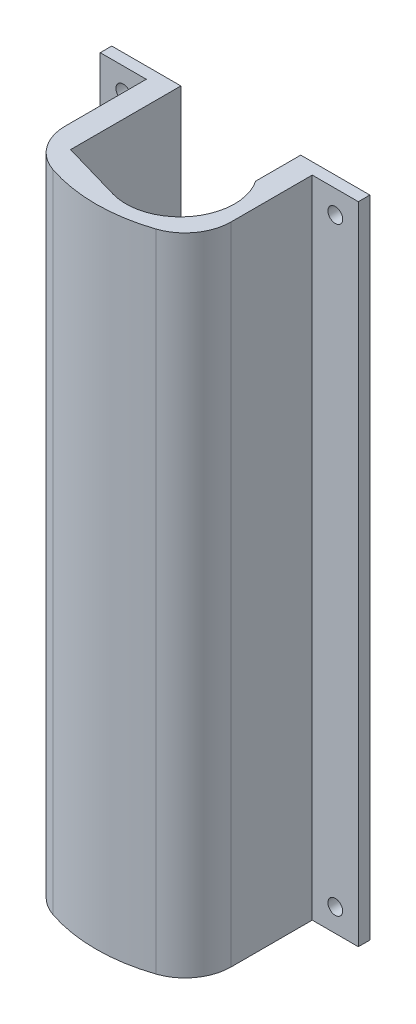
ISO-10303-21;
HEADER;
FILE_DESCRIPTION(('STEP AP214'),'2;1');
FILE_NAME('part.step','',(''),(''),'','','');
FILE_SCHEMA(('AUTOMOTIVE_DESIGN { 1 0 10303 214 1 1 1 1 }'));
ENDSEC;
DATA;
#1=APPLICATION_CONTEXT('core data for automotive mechanical design processes');
#2=APPLICATION_PROTOCOL_DEFINITION('international standard','automotive_design',2000,#1);
#3=PRODUCT_CONTEXT('',#1,'mechanical');
#4=PRODUCT('Part','Part','',(#3));
#5=PRODUCT_RELATED_PRODUCT_CATEGORY('part','',(#4));
#6=PRODUCT_DEFINITION_FORMATION('','',#4);
#7=PRODUCT_DEFINITION_CONTEXT('part definition',#1,'design');
#8=PRODUCT_DEFINITION('design','',#6,#7);
#9=PRODUCT_DEFINITION_SHAPE('','',#8);
#10=(LENGTH_UNIT() NAMED_UNIT(*) SI_UNIT(.MILLI.,.METRE.));
#11=(NAMED_UNIT(*) PLANE_ANGLE_UNIT() SI_UNIT($,.RADIAN.));
#12=(NAMED_UNIT(*) SI_UNIT($,.STERADIAN.) SOLID_ANGLE_UNIT());
#13=UNCERTAINTY_MEASURE_WITH_UNIT(LENGTH_MEASURE(1.E-05),#10,'distance_accuracy_value','');
#14=(GEOMETRIC_REPRESENTATION_CONTEXT(3) GLOBAL_UNCERTAINTY_ASSIGNED_CONTEXT((#13)) GLOBAL_UNIT_ASSIGNED_CONTEXT((#10,
#11,#12)) REPRESENTATION_CONTEXT('',''));
#15=CARTESIAN_POINT('',(0.,0.,0.));
#16=DIRECTION('',(0.,0.,1.));
#17=DIRECTION('',(1.,0.,0.));
#18=AXIS2_PLACEMENT_3D('',#15,#16,#17);
#19=CARTESIAN_POINT('',(-20.574,177.8,-9.65199999999999));
#20=DIRECTION('',(-1.,0.,0.));
#21=DIRECTION('',(0.,0.,1.));
#22=AXIS2_PLACEMENT_3D('',#19,#20,#21);
#23=PLANE('',#22);
#24=DIRECTION('',(0.,0.,-1.));
#25=VECTOR('',#24,1.);
#26=CARTESIAN_POINT('',(-20.574,0.,-9.65199999999999));
#27=LINE('',#26,#25);
#28=CARTESIAN_POINT('',(-20.574,0.,9.65212960437079));
#29=VERTEX_POINT('',#28);
#30=CARTESIAN_POINT('',(-20.574,0.,-20.7467128871305));
#31=VERTEX_POINT('',#30);
#32=EDGE_CURVE('E168',#29,#31,#27,.T.);
#33=ORIENTED_EDGE('',*,*,#32,.T.);
#34=DIRECTION('',(0.,-1.,0.));
#35=VECTOR('',#34,1.);
#36=CARTESIAN_POINT('',(-20.574,177.8,-20.7467128871305));
#37=LINE('',#36,#35);
#38=CARTESIAN_POINT('',(-20.574,177.8,-20.7467128871305));
#39=VERTEX_POINT('',#38);
#40=EDGE_CURVE('E167',#39,#31,#37,.T.);
#41=ORIENTED_EDGE('',*,*,#40,.F.);
#42=DIRECTION('',(0.,0.,-1.));
#43=VECTOR('',#42,1.);
#44=CARTESIAN_POINT('',(-20.574,177.8,-9.65199999999999));
#45=LINE('',#44,#43);
#46=CARTESIAN_POINT('',(-20.574,177.8,9.65212960437079));
#47=VERTEX_POINT('',#46);
#48=EDGE_CURVE('E152',#47,#39,#45,.T.);
#49=ORIENTED_EDGE('',*,*,#48,.F.);
#50=DIRECTION('',(0.,-1.,0.));
#51=VECTOR('',#50,1.);
#52=CARTESIAN_POINT('',(-20.574,177.8,9.65212960437079));
#53=LINE('',#52,#51);
#54=EDGE_CURVE('E214',#47,#29,#53,.T.);
#55=ORIENTED_EDGE('',*,*,#54,.T.);
#56=EDGE_LOOP('',(#33,#41,#49,#55));
#57=FACE_BOUND('',#56,.T.);
#58=ADVANCED_FACE('F43',(#57),#23,.F.);
#59=CARTESIAN_POINT('',(-39.624,177.8,-20.7467128871305));
#60=DIRECTION('',(0.,0.,1.));
#61=DIRECTION('',(1.,0.,0.));
#62=AXIS2_PLACEMENT_3D('',#59,#60,#61);
#63=PLANE('',#62);
#64=CARTESIAN_POINT('',(-33.274,6.35,-20.7467128871305));
#65=DIRECTION('',(0.,0.,1.));
#66=DIRECTION('',(1.,0.,0.));
#67=AXIS2_PLACEMENT_3D('',#64,#65,#66);
#68=CIRCLE('',#67,2.032);
#69=CARTESIAN_POINT('',(-31.242,6.35,-20.7467128871305));
#70=VERTEX_POINT('',#69);
#71=EDGE_CURVE('E586',#70,#70,#68,.T.);
#72=ORIENTED_EDGE('',*,*,#71,.T.);
#73=EDGE_LOOP('',(#72));
#74=FACE_BOUND('',#73,.T.);
#75=CARTESIAN_POINT('',(-33.274,171.45,-20.7467128871305));
#76=DIRECTION('',(0.,0.,1.));
#77=DIRECTION('',(1.,0.,0.));
#78=AXIS2_PLACEMENT_3D('',#75,#76,#77);
#79=CIRCLE('',#78,2.03200000000002);
#80=CARTESIAN_POINT('',(-31.242,171.45,-20.7467128871305));
#81=VERTEX_POINT('',#80);
#82=EDGE_CURVE('E218',#81,#81,#79,.T.);
#83=ORIENTED_EDGE('',*,*,#82,.T.);
#84=EDGE_LOOP('',(#83));
#85=FACE_BOUND('',#84,.T.);
#86=DIRECTION('',(-1.,0.,0.));
#87=VECTOR('',#86,1.);
#88=CARTESIAN_POINT('',(-39.624,0.,-20.7467128871305));
#89=LINE('',#88,#87);
#90=CARTESIAN_POINT('',(-39.624,0.,-20.7467128871305));
#91=VERTEX_POINT('',#90);
#92=EDGE_CURVE('E217',#31,#91,#89,.T.);
#93=ORIENTED_EDGE('',*,*,#92,.T.);
#94=DIRECTION('',(0.,-1.,0.));
#95=VECTOR('',#94,1.);
#96=CARTESIAN_POINT('',(-39.624,177.8,-20.7467128871305));
#97=LINE('',#96,#95);
#98=CARTESIAN_POINT('',(-39.624,177.8,-20.7467128871305));
#99=VERTEX_POINT('',#98);
#100=EDGE_CURVE('E173',#99,#91,#97,.T.);
#101=ORIENTED_EDGE('',*,*,#100,.F.);
#102=DIRECTION('',(-1.,0.,0.));
#103=VECTOR('',#102,1.);
#104=CARTESIAN_POINT('',(-39.624,177.8,-20.7467128871305));
#105=LINE('',#104,#103);
#106=EDGE_CURVE('E156',#39,#99,#105,.T.);
#107=ORIENTED_EDGE('',*,*,#106,.F.);
#108=ORIENTED_EDGE('',*,*,#40,.T.);
#109=EDGE_LOOP('',(#93,#101,#107,#108));
#110=FACE_BOUND('',#109,.T.);
#111=ADVANCED_FACE('F175',(#74,#85,#110),#63,.F.);
#112=CARTESIAN_POINT('',(-39.624,177.8,-20.7467128871305));
#113=DIRECTION('',(1.,0.,0.));
#114=DIRECTION('',(0.,0.,-1.));
#115=AXIS2_PLACEMENT_3D('',#112,#113,#114);
#116=PLANE('',#115);
#117=DIRECTION('',(0.,0.,1.));
#118=VECTOR('',#117,1.);
#119=CARTESIAN_POINT('',(-39.624,0.,-20.7467128871305));
#120=LINE('',#119,#118);
#121=CARTESIAN_POINT('',(-39.624,0.,-17.5717128871305));
#122=VERTEX_POINT('',#121);
#123=EDGE_CURVE('E221',#91,#122,#120,.T.);
#124=ORIENTED_EDGE('',*,*,#123,.T.);
#125=DIRECTION('',(0.,-1.,0.));
#126=VECTOR('',#125,1.);
#127=CARTESIAN_POINT('',(-39.624,177.8,-17.5717128871305));
#128=LINE('',#127,#126);
#129=CARTESIAN_POINT('',(-39.624,177.8,-17.5717128871305));
#130=VERTEX_POINT('',#129);
#131=EDGE_CURVE('E284',#130,#122,#128,.T.);
#132=ORIENTED_EDGE('',*,*,#131,.F.);
#133=DIRECTION('',(0.,0.,1.));
#134=VECTOR('',#133,1.);
#135=CARTESIAN_POINT('',(-39.624,177.8,-20.7467128871305));
#136=LINE('',#135,#134);
#137=EDGE_CURVE('E179',#99,#130,#136,.T.);
#138=ORIENTED_EDGE('',*,*,#137,.F.);
#139=ORIENTED_EDGE('',*,*,#100,.T.);
#140=EDGE_LOOP('',(#124,#132,#138,#139));
#141=FACE_BOUND('',#140,.T.);
#142=ADVANCED_FACE('F336',(#141),#116,.F.);
#143=CARTESIAN_POINT('',(-39.624,177.8,-17.5717128871305));
#144=DIRECTION('',(0.,0.,-1.));
#145=DIRECTION('',(-1.,0.,0.));
#146=AXIS2_PLACEMENT_3D('',#143,#144,#145);
#147=PLANE('',#146);
#148=CARTESIAN_POINT('',(-33.274,6.35,-17.5717128871305));
#149=DIRECTION('',(0.,0.,1.));
#150=DIRECTION('',(1.,0.,0.));
#151=AXIS2_PLACEMENT_3D('',#148,#149,#150);
#152=CIRCLE('',#151,2.032);
#153=CARTESIAN_POINT('',(-31.242,6.35,-17.5717128871305));
#154=VERTEX_POINT('',#153);
#155=EDGE_CURVE('E591',#154,#154,#152,.T.);
#156=ORIENTED_EDGE('',*,*,#155,.F.);
#157=EDGE_LOOP('',(#156));
#158=FACE_BOUND('',#157,.T.);
#159=CARTESIAN_POINT('',(-33.274,171.45,-17.5717128871305));
#160=DIRECTION('',(0.,0.,1.));
#161=DIRECTION('',(1.,0.,0.));
#162=AXIS2_PLACEMENT_3D('',#159,#160,#161);
#163=CIRCLE('',#162,2.03200000000002);
#164=CARTESIAN_POINT('',(-31.242,171.45,-17.5717128871305));
#165=VERTEX_POINT('',#164);
#166=EDGE_CURVE('E590',#165,#165,#163,.T.);
#167=ORIENTED_EDGE('',*,*,#166,.F.);
#168=EDGE_LOOP('',(#167));
#169=FACE_BOUND('',#168,.T.);
#170=DIRECTION('',(1.,0.,0.));
#171=VECTOR('',#170,1.);
#172=CARTESIAN_POINT('',(-39.624,0.,-17.5717128871305));
#173=LINE('',#172,#171);
#174=CARTESIAN_POINT('',(-26.924,0.,-17.5717128871305));
#175=VERTEX_POINT('',#174);
#176=EDGE_CURVE('E224',#122,#175,#173,.T.);
#177=ORIENTED_EDGE('',*,*,#176,.T.);
#178=DIRECTION('',(0.,-1.,0.));
#179=VECTOR('',#178,1.);
#180=CARTESIAN_POINT('',(-26.924,177.8,-17.5717128871305));
#181=LINE('',#180,#179);
#182=CARTESIAN_POINT('',(-26.924,177.8,-17.5717128871305));
#183=VERTEX_POINT('',#182);
#184=EDGE_CURVE('E280',#183,#175,#181,.T.);
#185=ORIENTED_EDGE('',*,*,#184,.F.);
#186=DIRECTION('',(1.,0.,0.));
#187=VECTOR('',#186,1.);
#188=CARTESIAN_POINT('',(-39.624,177.8,-17.5717128871305));
#189=LINE('',#188,#187);
#190=EDGE_CURVE('E182',#130,#183,#189,.T.);
#191=ORIENTED_EDGE('',*,*,#190,.F.);
#192=ORIENTED_EDGE('',*,*,#131,.T.);
#193=EDGE_LOOP('',(#177,#185,#191,#192));
#194=FACE_BOUND('',#193,.T.);
#195=ADVANCED_FACE('F332',(#158,#169,#194),#147,.F.);
#196=CARTESIAN_POINT('',(-26.924,177.8,-17.5717128871305));
#197=DIRECTION('',(1.,0.,0.));
#198=DIRECTION('',(0.,0.,-1.));
#199=AXIS2_PLACEMENT_3D('',#196,#197,#198);
#200=PLANE('',#199);
#201=DIRECTION('',(0.,0.,1.));
#202=VECTOR('',#201,1.);
#203=CARTESIAN_POINT('',(-26.924,0.,-17.5717128871305));
#204=LINE('',#203,#202);
#205=CARTESIAN_POINT('',(-26.924,0.,4.78647579118017));
#206=VERTEX_POINT('',#205);
#207=EDGE_CURVE('E227',#175,#206,#204,.T.);
#208=ORIENTED_EDGE('',*,*,#207,.T.);
#209=DIRECTION('',(0.,-1.,0.));
#210=VECTOR('',#209,1.);
#211=CARTESIAN_POINT('',(-26.924,177.8,4.78647579118017));
#212=LINE('',#211,#210);
#213=CARTESIAN_POINT('',(-26.924,177.8,4.78647579118017));
#214=VERTEX_POINT('',#213);
#215=EDGE_CURVE('E11',#206,#214,#212,.F.);
#216=ORIENTED_EDGE('',*,*,#215,.T.);
#217=DIRECTION('',(0.,0.,1.));
#218=VECTOR('',#217,1.);
#219=CARTESIAN_POINT('',(-26.924,177.8,-17.5717128871305));
#220=LINE('',#219,#218);
#221=EDGE_CURVE('E188',#183,#214,#220,.T.);
#222=ORIENTED_EDGE('',*,*,#221,.F.);
#223=ORIENTED_EDGE('',*,*,#184,.T.);
#224=EDGE_LOOP('',(#208,#216,#222,#223));
#225=FACE_BOUND('',#224,.T.);
#226=ADVANCED_FACE('F328',(#225),#200,.F.);
#227=CARTESIAN_POINT('',(-4.06400000000001,177.8,-25.2940311859304));
#228=DIRECTION('',(0.,-1.,0.));
#229=DIRECTION('',(0.,0.,-1.));
#230=AXIS2_PLACEMENT_3D('',#227,#228,#229);
#231=CYLINDRICAL_SURFACE('',#230,44.45);
#232=CARTESIAN_POINT('',(-4.06400000000001,0.,-25.2940311859304));
#233=DIRECTION('',(0.,1.,0.));
#234=DIRECTION('',(0.,0.,1.));
#235=AXIS2_PLACEMENT_3D('',#232,#233,#234);
#236=CIRCLE('',#235,44.45);
#237=CARTESIAN_POINT('',(-18.288,0.,16.8186785820244));
#238=VERTEX_POINT('',#237);
#239=CARTESIAN_POINT('',(10.16,0.,16.8186785820244));
#240=VERTEX_POINT('',#239);
#241=EDGE_CURVE('E230',#238,#240,#236,.T.);
#242=ORIENTED_EDGE('',*,*,#241,.T.);
#243=DIRECTION('',(0.,-1.,0.));
#244=VECTOR('',#243,1.);
#245=CARTESIAN_POINT('',(10.16,177.8,16.8186785820244));
#246=LINE('',#245,#244);
#247=CARTESIAN_POINT('',(10.16,177.8,16.8186785820244));
#248=VERTEX_POINT('',#247);
#249=EDGE_CURVE('E65',#240,#248,#246,.F.);
#250=ORIENTED_EDGE('',*,*,#249,.T.);
#251=CARTESIAN_POINT('',(-4.06400000000001,177.8,-25.2940311859304));
#252=DIRECTION('',(0.,1.,0.));
#253=DIRECTION('',(0.,0.,1.));
#254=AXIS2_PLACEMENT_3D('',#251,#252,#253);
#255=CIRCLE('',#254,44.45);
#256=CARTESIAN_POINT('',(-18.288,177.8,16.8186785820244));
#257=VERTEX_POINT('',#256);
#258=EDGE_CURVE('E191',#257,#248,#255,.T.);
#259=ORIENTED_EDGE('',*,*,#258,.F.);
#260=DIRECTION('',(0.,-1.,0.));
#261=VECTOR('',#260,1.);
#262=CARTESIAN_POINT('',(-18.288,177.8,16.8186785820244));
#263=LINE('',#262,#261);
#264=EDGE_CURVE('E299',#257,#238,#263,.T.);
#265=ORIENTED_EDGE('',*,*,#264,.T.);
#266=EDGE_LOOP('',(#242,#250,#259,#265));
#267=FACE_BOUND('',#266,.T.);
#268=ADVANCED_FACE('F322',(#267),#231,.T.);
#269=CARTESIAN_POINT('',(18.796,177.8,-17.5717128871305));
#270=DIRECTION('',(-1.,0.,0.));
#271=DIRECTION('',(0.,0.,1.));
#272=AXIS2_PLACEMENT_3D('',#269,#270,#271);
#273=PLANE('',#272);
#274=DIRECTION('',(0.,0.,-1.));
#275=VECTOR('',#274,1.);
#276=CARTESIAN_POINT('',(18.796,177.8,-17.5717128871305));
#277=LINE('',#276,#275);
#278=CARTESIAN_POINT('',(18.796,177.8,4.78647579118017));
#279=VERTEX_POINT('',#278);
#280=CARTESIAN_POINT('',(18.796,177.8,-17.5717128871305));
#281=VERTEX_POINT('',#280);
#282=EDGE_CURVE('E194',#279,#281,#277,.T.);
#283=ORIENTED_EDGE('',*,*,#282,.F.);
#284=DIRECTION('',(0.,-1.,0.));
#285=VECTOR('',#284,1.);
#286=CARTESIAN_POINT('',(18.796,177.8,4.78647579118017));
#287=LINE('',#286,#285);
#288=CARTESIAN_POINT('',(18.796,0.,4.78647579118017));
#289=VERTEX_POINT('',#288);
#290=EDGE_CURVE('E172',#279,#289,#287,.T.);
#291=ORIENTED_EDGE('',*,*,#290,.T.);
#292=DIRECTION('',(0.,0.,-1.));
#293=VECTOR('',#292,1.);
#294=CARTESIAN_POINT('',(18.796,0.,-17.5717128871305));
#295=LINE('',#294,#293);
#296=CARTESIAN_POINT('',(18.796,0.,-17.5717128871305));
#297=VERTEX_POINT('',#296);
#298=EDGE_CURVE('E233',#289,#297,#295,.T.);
#299=ORIENTED_EDGE('',*,*,#298,.T.);
#300=DIRECTION('',(0.,-1.,0.));
#301=VECTOR('',#300,1.);
#302=CARTESIAN_POINT('',(18.796,177.8,-17.5717128871305));
#303=LINE('',#302,#301);
#304=EDGE_CURVE('E276',#281,#297,#303,.T.);
#305=ORIENTED_EDGE('',*,*,#304,.F.);
#306=EDGE_LOOP('',(#283,#291,#299,#305));
#307=FACE_BOUND('',#306,.T.);
#308=ADVANCED_FACE('F314',(#307),#273,.F.);
#309=CARTESIAN_POINT('',(31.496,177.8,-17.5717128871305));
#310=DIRECTION('',(0.,0.,-1.));
#311=DIRECTION('',(-1.,0.,0.));
#312=AXIS2_PLACEMENT_3D('',#309,#310,#311);
#313=PLANE('',#312);
#314=CARTESIAN_POINT('',(25.146,171.45,-17.5717128871305));
#315=DIRECTION('',(0.,0.,1.));
#316=DIRECTION('',(1.,0.,0.));
#317=AXIS2_PLACEMENT_3D('',#314,#315,#316);
#318=CIRCLE('',#317,2.03200000000002);
#319=CARTESIAN_POINT('',(27.178,171.45,-17.5717128871305));
#320=VERTEX_POINT('',#319);
#321=EDGE_CURVE('E583',#320,#320,#318,.T.);
#322=ORIENTED_EDGE('',*,*,#321,.F.);
#323=EDGE_LOOP('',(#322));
#324=FACE_BOUND('',#323,.T.);
#325=CARTESIAN_POINT('',(25.146,6.35000000000002,-17.5717128871305));
#326=DIRECTION('',(0.,0.,1.));
#327=DIRECTION('',(1.,0.,0.));
#328=AXIS2_PLACEMENT_3D('',#325,#326,#327);
#329=CIRCLE('',#328,2.032);
#330=CARTESIAN_POINT('',(27.178,6.35000000000002,-17.5717128871305));
#331=VERTEX_POINT('',#330);
#332=EDGE_CURVE('E578',#331,#331,#329,.T.);
#333=ORIENTED_EDGE('',*,*,#332,.F.);
#334=EDGE_LOOP('',(#333));
#335=FACE_BOUND('',#334,.T.);
#336=DIRECTION('',(1.,0.,0.));
#337=VECTOR('',#336,1.);
#338=CARTESIAN_POINT('',(31.496,0.,-17.5717128871305));
#339=LINE('',#338,#337);
#340=CARTESIAN_POINT('',(31.496,0.,-17.5717128871305));
#341=VERTEX_POINT('',#340);
#342=EDGE_CURVE('E236',#297,#341,#339,.T.);
#343=ORIENTED_EDGE('',*,*,#342,.T.);
#344=DIRECTION('',(0.,-1.,0.));
#345=VECTOR('',#344,1.);
#346=CARTESIAN_POINT('',(31.496,177.8,-17.5717128871305));
#347=LINE('',#346,#345);
#348=CARTESIAN_POINT('',(31.496,177.8,-17.5717128871305));
#349=VERTEX_POINT('',#348);
#350=EDGE_CURVE('E272',#349,#341,#347,.T.);
#351=ORIENTED_EDGE('',*,*,#350,.F.);
#352=DIRECTION('',(1.,0.,0.));
#353=VECTOR('',#352,1.);
#354=CARTESIAN_POINT('',(31.496,177.8,-17.5717128871305));
#355=LINE('',#354,#353);
#356=EDGE_CURVE('E197',#281,#349,#355,.T.);
#357=ORIENTED_EDGE('',*,*,#356,.F.);
#358=ORIENTED_EDGE('',*,*,#304,.T.);
#359=EDGE_LOOP('',(#343,#351,#357,#358));
#360=FACE_BOUND('',#359,.T.);
#361=ADVANCED_FACE('F397',(#324,#335,#360),#313,.F.);
#362=CARTESIAN_POINT('',(31.496,177.8,-20.7467128871305));
#363=DIRECTION('',(-1.,0.,0.));
#364=DIRECTION('',(0.,0.,1.));
#365=AXIS2_PLACEMENT_3D('',#362,#363,#364);
#366=PLANE('',#365);
#367=DIRECTION('',(0.,0.,-1.));
#368=VECTOR('',#367,1.);
#369=CARTESIAN_POINT('',(31.496,0.,-20.7467128871305));
#370=LINE('',#369,#368);
#371=CARTESIAN_POINT('',(31.496,0.,-20.7467128871305));
#372=VERTEX_POINT('',#371);
#373=EDGE_CURVE('E239',#341,#372,#370,.T.);
#374=ORIENTED_EDGE('',*,*,#373,.T.);
#375=DIRECTION('',(0.,-1.,0.));
#376=VECTOR('',#375,1.);
#377=CARTESIAN_POINT('',(31.496,177.8,-20.7467128871305));
#378=LINE('',#377,#376);
#379=CARTESIAN_POINT('',(31.496,177.8,-20.7467128871305));
#380=VERTEX_POINT('',#379);
#381=EDGE_CURVE('E268',#380,#372,#378,.T.);
#382=ORIENTED_EDGE('',*,*,#381,.F.);
#383=DIRECTION('',(0.,0.,-1.));
#384=VECTOR('',#383,1.);
#385=CARTESIAN_POINT('',(31.496,177.8,-20.7467128871305));
#386=LINE('',#385,#384);
#387=EDGE_CURVE('E200',#349,#380,#386,.T.);
#388=ORIENTED_EDGE('',*,*,#387,.F.);
#389=ORIENTED_EDGE('',*,*,#350,.T.);
#390=EDGE_LOOP('',(#374,#382,#388,#389));
#391=FACE_BOUND('',#390,.T.);
#392=ADVANCED_FACE('F393',(#391),#366,.F.);
#393=CARTESIAN_POINT('',(12.446,177.8,-20.7467128871305));
#394=DIRECTION('',(0.,0.,1.));
#395=DIRECTION('',(1.,0.,0.));
#396=AXIS2_PLACEMENT_3D('',#393,#394,#395);
#397=PLANE('',#396);
#398=CARTESIAN_POINT('',(25.146,171.45,-20.7467128871305));
#399=DIRECTION('',(0.,0.,1.));
#400=DIRECTION('',(1.,0.,0.));
#401=AXIS2_PLACEMENT_3D('',#398,#399,#400);
#402=CIRCLE('',#401,2.03200000000002);
#403=CARTESIAN_POINT('',(27.178,171.45,-20.7467128871305));
#404=VERTEX_POINT('',#403);
#405=EDGE_CURVE('E595',#404,#404,#402,.T.);
#406=ORIENTED_EDGE('',*,*,#405,.T.);
#407=EDGE_LOOP('',(#406));
#408=FACE_BOUND('',#407,.T.);
#409=CARTESIAN_POINT('',(25.146,6.35000000000002,-20.7467128871305));
#410=DIRECTION('',(0.,0.,1.));
#411=DIRECTION('',(1.,0.,0.));
#412=AXIS2_PLACEMENT_3D('',#409,#410,#411);
#413=CIRCLE('',#412,2.032);
#414=CARTESIAN_POINT('',(27.178,6.35000000000002,-20.7467128871305));
#415=VERTEX_POINT('',#414);
#416=EDGE_CURVE('E575',#415,#415,#413,.T.);
#417=ORIENTED_EDGE('',*,*,#416,.T.);
#418=EDGE_LOOP('',(#417));
#419=FACE_BOUND('',#418,.T.);
#420=DIRECTION('',(-1.,0.,0.));
#421=VECTOR('',#420,1.);
#422=CARTESIAN_POINT('',(12.446,0.,-20.7467128871305));
#423=LINE('',#422,#421);
#424=CARTESIAN_POINT('',(12.446,0.,-20.7467128871305));
#425=VERTEX_POINT('',#424);
#426=EDGE_CURVE('E242',#372,#425,#423,.T.);
#427=ORIENTED_EDGE('',*,*,#426,.T.);
#428=DIRECTION('',(0.,-1.,0.));
#429=VECTOR('',#428,1.);
#430=CARTESIAN_POINT('',(12.446,177.8,-20.7467128871305));
#431=LINE('',#430,#429);
#432=CARTESIAN_POINT('',(12.446,177.8,-20.7467128871305));
#433=VERTEX_POINT('',#432);
#434=EDGE_CURVE('E264',#433,#425,#431,.T.);
#435=ORIENTED_EDGE('',*,*,#434,.F.);
#436=DIRECTION('',(-1.,0.,0.));
#437=VECTOR('',#436,1.);
#438=CARTESIAN_POINT('',(12.446,177.8,-20.7467128871305));
#439=LINE('',#438,#437);
#440=EDGE_CURVE('E203',#380,#433,#439,.T.);
#441=ORIENTED_EDGE('',*,*,#440,.F.);
#442=ORIENTED_EDGE('',*,*,#381,.T.);
#443=EDGE_LOOP('',(#427,#435,#441,#442));
#444=FACE_BOUND('',#443,.T.);
#445=ADVANCED_FACE('F389',(#408,#419,#444),#397,.F.);
#446=CARTESIAN_POINT('',(12.446,177.8,-20.7467128871305));
#447=DIRECTION('',(1.,0.,0.));
#448=DIRECTION('',(0.,0.,-1.));
#449=AXIS2_PLACEMENT_3D('',#446,#447,#448);
#450=PLANE('',#449);
#451=DIRECTION('',(0.,0.,1.));
#452=VECTOR('',#451,1.);
#453=CARTESIAN_POINT('',(12.446,0.,-20.7467128871305));
#454=LINE('',#453,#452);
#455=CARTESIAN_POINT('',(12.446,0.,-8.34779649654001));
#456=VERTEX_POINT('',#455);
#457=EDGE_CURVE('E245',#425,#456,#454,.T.);
#458=ORIENTED_EDGE('',*,*,#457,.T.);
#459=DIRECTION('',(0.,-1.,0.));
#460=VECTOR('',#459,1.);
#461=CARTESIAN_POINT('',(12.446,177.8,-8.34779649654001));
#462=LINE('',#461,#460);
#463=CARTESIAN_POINT('',(12.446,177.8,-8.34779649654001));
#464=VERTEX_POINT('',#463);
#465=EDGE_CURVE('E260',#464,#456,#462,.T.);
#466=ORIENTED_EDGE('',*,*,#465,.F.);
#467=DIRECTION('',(0.,0.,1.));
#468=VECTOR('',#467,1.);
#469=CARTESIAN_POINT('',(12.446,177.8,-20.7467128871305));
#470=LINE('',#469,#468);
#471=EDGE_CURVE('E206',#433,#464,#470,.T.);
#472=ORIENTED_EDGE('',*,*,#471,.F.);
#473=ORIENTED_EDGE('',*,*,#434,.T.);
#474=EDGE_LOOP('',(#458,#466,#472,#473));
#475=FACE_BOUND('',#474,.T.);
#476=ADVANCED_FACE('F385',(#475),#450,.F.);
#477=CARTESIAN_POINT('',(0.,177.8,0.));
#478=DIRECTION('',(0.,-1.,0.));
#479=DIRECTION('',(0.,0.,-1.));
#480=AXIS2_PLACEMENT_3D('',#477,#478,#479);
#481=CYLINDRICAL_SURFACE('',#480,14.9862811380157);
#482=CARTESIAN_POINT('',(0.,0.,0.));
#483=DIRECTION('',(0.,-1.,0.));
#484=DIRECTION('',(0.,0.,1.));
#485=AXIS2_PLACEMENT_3D('',#482,#483,#484);
#486=CIRCLE('',#485,14.9862811380157);
#487=CARTESIAN_POINT('',(-4.16201958345776,0.,14.3967432197202));
#488=VERTEX_POINT('',#487);
#489=EDGE_CURVE('E248',#456,#488,#486,.T.);
#490=ORIENTED_EDGE('',*,*,#489,.T.);
#491=DIRECTION('',(0.,-1.,0.));
#492=VECTOR('',#491,1.);
#493=CARTESIAN_POINT('',(-4.16201958345776,177.8,14.3967432197202));
#494=LINE('',#493,#492);
#495=CARTESIAN_POINT('',(-4.16201958345776,177.8,14.3967432197202));
#496=VERTEX_POINT('',#495);
#497=EDGE_CURVE('E256',#496,#488,#494,.T.);
#498=ORIENTED_EDGE('',*,*,#497,.F.);
#499=CARTESIAN_POINT('',(0.,177.8,0.));
#500=DIRECTION('',(0.,-1.,0.));
#501=DIRECTION('',(0.,0.,1.));
#502=AXIS2_PLACEMENT_3D('',#499,#500,#501);
#503=CIRCLE('',#502,14.9862811380157);
#504=EDGE_CURVE('E209',#464,#496,#503,.T.);
#505=ORIENTED_EDGE('',*,*,#504,.F.);
#506=ORIENTED_EDGE('',*,*,#465,.T.);
#507=EDGE_LOOP('',(#490,#498,#505,#506));
#508=FACE_BOUND('',#507,.T.);
#509=ADVANCED_FACE('F381',(#508),#481,.F.);
#510=CARTESIAN_POINT('',(-20.574,177.8,9.65212960437079));
#511=DIRECTION('',(-0.27772197419278,0.,0.960661493477523));
#512=DIRECTION('',(0.960661493477523,0.,0.27772197419278));
#513=AXIS2_PLACEMENT_3D('',#510,#511,#512);
#514=PLANE('',#513);
#515=DIRECTION('',(-0.960661493477523,0.,-0.27772197419278));
#516=VECTOR('',#515,1.);
#517=CARTESIAN_POINT('',(-20.574,0.,9.65212960437079));
#518=LINE('',#517,#516);
#519=EDGE_CURVE('E164',#488,#29,#518,.T.);
#520=ORIENTED_EDGE('',*,*,#519,.T.);
#521=ORIENTED_EDGE('',*,*,#54,.F.);
#522=DIRECTION('',(-0.960661493477523,0.,-0.27772197419278));
#523=VECTOR('',#522,1.);
#524=CARTESIAN_POINT('',(-20.574,177.8,9.65212960437079));
#525=LINE('',#524,#523);
#526=EDGE_CURVE('E159',#496,#47,#525,.T.);
#527=ORIENTED_EDGE('',*,*,#526,.F.);
#528=ORIENTED_EDGE('',*,*,#497,.T.);
#529=EDGE_LOOP('',(#520,#521,#527,#528));
#530=FACE_BOUND('',#529,.T.);
#531=ADVANCED_FACE('F376',(#530),#514,.F.);
#532=CARTESIAN_POINT('',(0.,177.8,0.));
#533=DIRECTION('',(0.,1.,0.));
#534=DIRECTION('',(0.,0.,1.));
#535=AXIS2_PLACEMENT_3D('',#532,#533,#534);
#536=PLANE('',#535);
#537=ORIENTED_EDGE('',*,*,#258,.T.);
#538=CARTESIAN_POINT('',(6.09599999999999,177.8,4.78647579118017));
#539=DIRECTION('',(0.,1.,0.));
#540=DIRECTION('',(0.,0.,1.));
#541=AXIS2_PLACEMENT_3D('',#538,#539,#540);
#542=CIRCLE('',#541,12.7);
#543=EDGE_CURVE('E52',#248,#279,#542,.T.);
#544=ORIENTED_EDGE('',*,*,#543,.T.);
#545=ORIENTED_EDGE('',*,*,#282,.T.);
#546=ORIENTED_EDGE('',*,*,#356,.T.);
#547=ORIENTED_EDGE('',*,*,#387,.T.);
#548=ORIENTED_EDGE('',*,*,#440,.T.);
#549=ORIENTED_EDGE('',*,*,#471,.T.);
#550=ORIENTED_EDGE('',*,*,#504,.T.);
#551=ORIENTED_EDGE('',*,*,#526,.T.);
#552=ORIENTED_EDGE('',*,*,#48,.T.);
#553=ORIENTED_EDGE('',*,*,#106,.T.);
#554=ORIENTED_EDGE('',*,*,#137,.T.);
#555=ORIENTED_EDGE('',*,*,#190,.T.);
#556=ORIENTED_EDGE('',*,*,#221,.T.);
#557=CARTESIAN_POINT('',(-14.224,177.8,4.78647579118017));
#558=DIRECTION('',(0.,1.,0.));
#559=DIRECTION('',(0.,0.,1.));
#560=AXIS2_PLACEMENT_3D('',#557,#558,#559);
#561=CIRCLE('',#560,12.7);
#562=EDGE_CURVE('E305',#214,#257,#561,.T.);
#563=ORIENTED_EDGE('',*,*,#562,.T.);
#564=EDGE_LOOP('',(#537,#544,#545,#546,#547,#548,#549,#550,#551,#552,#553,#554,#555,#556,#563));
#565=FACE_BOUND('',#564,.T.);
#566=ADVANCED_FACE('F154',(#565),#536,.T.);
#567=CARTESIAN_POINT('',(0.,0.,0.));
#568=DIRECTION('',(0.,1.,0.));
#569=DIRECTION('',(0.,0.,1.));
#570=AXIS2_PLACEMENT_3D('',#567,#568,#569);
#571=PLANE('',#570);
#572=ORIENTED_EDGE('',*,*,#298,.F.);
#573=CARTESIAN_POINT('',(6.09599999999999,0.,4.78647579118017));
#574=DIRECTION('',(0.,1.,0.));
#575=DIRECTION('',(0.,0.,1.));
#576=AXIS2_PLACEMENT_3D('',#573,#574,#575);
#577=CIRCLE('',#576,12.7);
#578=EDGE_CURVE('E296',#289,#240,#577,.F.);
#579=ORIENTED_EDGE('',*,*,#578,.T.);
#580=ORIENTED_EDGE('',*,*,#241,.F.);
#581=CARTESIAN_POINT('',(-14.224,0.,4.78647579118017));
#582=DIRECTION('',(0.,1.,0.));
#583=DIRECTION('',(0.,0.,1.));
#584=AXIS2_PLACEMENT_3D('',#581,#582,#583);
#585=CIRCLE('',#584,12.7);
#586=EDGE_CURVE('E293',#238,#206,#585,.F.);
#587=ORIENTED_EDGE('',*,*,#586,.T.);
#588=ORIENTED_EDGE('',*,*,#207,.F.);
#589=ORIENTED_EDGE('',*,*,#176,.F.);
#590=ORIENTED_EDGE('',*,*,#123,.F.);
#591=ORIENTED_EDGE('',*,*,#92,.F.);
#592=ORIENTED_EDGE('',*,*,#32,.F.);
#593=ORIENTED_EDGE('',*,*,#519,.F.);
#594=ORIENTED_EDGE('',*,*,#489,.F.);
#595=ORIENTED_EDGE('',*,*,#457,.F.);
#596=ORIENTED_EDGE('',*,*,#426,.F.);
#597=ORIENTED_EDGE('',*,*,#373,.F.);
#598=ORIENTED_EDGE('',*,*,#342,.F.);
#599=EDGE_LOOP('',(#572,#579,#580,#587,#588,#589,#590,#591,#592,#593,#594,#595,#596,#597,#598));
#600=FACE_BOUND('',#599,.T.);
#601=ADVANCED_FACE('F320',(#600),#571,.F.);
#602=CARTESIAN_POINT('',(25.146,6.35000000000002,-20.7467128871305));
#603=DIRECTION('',(0.,0.,1.));
#604=DIRECTION('',(1.,0.,0.));
#605=AXIS2_PLACEMENT_3D('',#602,#603,#604);
#606=CYLINDRICAL_SURFACE('',#605,2.032);
#607=ORIENTED_EDGE('',*,*,#416,.F.);
#608=EDGE_LOOP('',(#607));
#609=FACE_BOUND('',#608,.T.);
#610=ORIENTED_EDGE('',*,*,#332,.T.);
#611=EDGE_LOOP('',(#610));
#612=FACE_BOUND('',#611,.T.);
#613=ADVANCED_FACE('F370',(#609,#612),#606,.F.);
#614=CARTESIAN_POINT('',(25.146,171.45,-20.7467128871305));
#615=DIRECTION('',(0.,0.,1.));
#616=DIRECTION('',(1.,0.,0.));
#617=AXIS2_PLACEMENT_3D('',#614,#615,#616);
#618=CYLINDRICAL_SURFACE('',#617,2.03200000000002);
#619=ORIENTED_EDGE('',*,*,#405,.F.);
#620=EDGE_LOOP('',(#619));
#621=FACE_BOUND('',#620,.T.);
#622=ORIENTED_EDGE('',*,*,#321,.T.);
#623=EDGE_LOOP('',(#622));
#624=FACE_BOUND('',#623,.T.);
#625=ADVANCED_FACE('F363',(#621,#624),#618,.F.);
#626=CARTESIAN_POINT('',(-33.274,171.45,-20.7467128871305));
#627=DIRECTION('',(0.,0.,1.));
#628=DIRECTION('',(1.,0.,0.));
#629=AXIS2_PLACEMENT_3D('',#626,#627,#628);
#630=CYLINDRICAL_SURFACE('',#629,2.03200000000002);
#631=ORIENTED_EDGE('',*,*,#82,.F.);
#632=EDGE_LOOP('',(#631));
#633=FACE_BOUND('',#632,.T.);
#634=ORIENTED_EDGE('',*,*,#166,.T.);
#635=EDGE_LOOP('',(#634));
#636=FACE_BOUND('',#635,.T.);
#637=ADVANCED_FACE('F357',(#633,#636),#630,.F.);
#638=CARTESIAN_POINT('',(-33.274,6.35,-20.7467128871305));
#639=DIRECTION('',(0.,0.,1.));
#640=DIRECTION('',(1.,0.,0.));
#641=AXIS2_PLACEMENT_3D('',#638,#639,#640);
#642=CYLINDRICAL_SURFACE('',#641,2.032);
#643=ORIENTED_EDGE('',*,*,#71,.F.);
#644=EDGE_LOOP('',(#643));
#645=FACE_BOUND('',#644,.T.);
#646=ORIENTED_EDGE('',*,*,#155,.T.);
#647=EDGE_LOOP('',(#646));
#648=FACE_BOUND('',#647,.T.);
#649=ADVANCED_FACE('F352',(#645,#648),#642,.F.);
#650=CARTESIAN_POINT('',(6.09599999999999,177.8,4.78647579118017));
#651=DIRECTION('',(0.,-1.,0.));
#652=DIRECTION('',(0.,0.,-1.));
#653=AXIS2_PLACEMENT_3D('',#650,#651,#652);
#654=CYLINDRICAL_SURFACE('',#653,12.7);
#655=ORIENTED_EDGE('',*,*,#543,.F.);
#656=ORIENTED_EDGE('',*,*,#249,.F.);
#657=ORIENTED_EDGE('',*,*,#578,.F.);
#658=ORIENTED_EDGE('',*,*,#290,.F.);
#659=EDGE_LOOP('',(#655,#656,#657,#658));
#660=FACE_BOUND('',#659,.T.);
#661=ADVANCED_FACE('F317',(#660),#654,.T.);
#662=CARTESIAN_POINT('',(-14.224,177.8,4.78647579118017));
#663=DIRECTION('',(0.,-1.,0.));
#664=DIRECTION('',(0.,0.,-1.));
#665=AXIS2_PLACEMENT_3D('',#662,#663,#664);
#666=CYLINDRICAL_SURFACE('',#665,12.7);
#667=ORIENTED_EDGE('',*,*,#562,.F.);
#668=ORIENTED_EDGE('',*,*,#215,.F.);
#669=ORIENTED_EDGE('',*,*,#586,.F.);
#670=ORIENTED_EDGE('',*,*,#264,.F.);
#671=EDGE_LOOP('',(#667,#668,#669,#670));
#672=FACE_BOUND('',#671,.T.);
#673=ADVANCED_FACE('F45',(#672),#666,.T.);
#674=CLOSED_SHELL('',(#58,#111,#142,#195,#226,#268,#308,#361,#392,#445,#476,#509,#531,#566,#601,
#613,#625,#637,#649,#661,#673));
#675=MANIFOLD_SOLID_BREP('B2',#674);
#676=ADVANCED_BREP_SHAPE_REPRESENTATION('',(#18,#675),#14);
#677=SHAPE_DEFINITION_REPRESENTATION(#9,#676);
ENDSEC;
END-ISO-10303-21;
